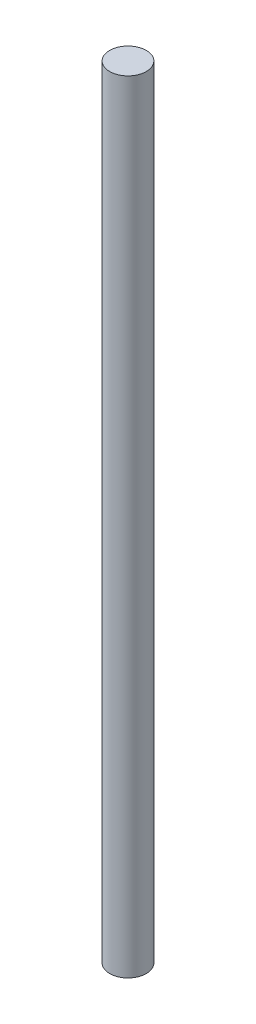
ISO-10303-21;
HEADER;
FILE_DESCRIPTION(('STEP AP214'),'2;1');
FILE_NAME('part.step','',(''),(''),'','','');
FILE_SCHEMA(('AUTOMOTIVE_DESIGN { 1 0 10303 214 1 1 1 1 }'));
ENDSEC;
DATA;
#1=APPLICATION_CONTEXT('core data for automotive mechanical design processes');
#2=APPLICATION_PROTOCOL_DEFINITION('international standard','automotive_design',2000,#1);
#3=PRODUCT_CONTEXT('',#1,'mechanical');
#4=PRODUCT('Part','Part','',(#3));
#5=PRODUCT_RELATED_PRODUCT_CATEGORY('part','',(#4));
#6=PRODUCT_DEFINITION_FORMATION('','',#4);
#7=PRODUCT_DEFINITION_CONTEXT('part definition',#1,'design');
#8=PRODUCT_DEFINITION('design','',#6,#7);
#9=PRODUCT_DEFINITION_SHAPE('','',#8);
#10=(LENGTH_UNIT() NAMED_UNIT(*) SI_UNIT(.MILLI.,.METRE.));
#11=(NAMED_UNIT(*) PLANE_ANGLE_UNIT() SI_UNIT($,.RADIAN.));
#12=(NAMED_UNIT(*) SI_UNIT($,.STERADIAN.) SOLID_ANGLE_UNIT());
#13=UNCERTAINTY_MEASURE_WITH_UNIT(LENGTH_MEASURE(1.E-05),#10,'distance_accuracy_value','');
#14=(GEOMETRIC_REPRESENTATION_CONTEXT(3) GLOBAL_UNCERTAINTY_ASSIGNED_CONTEXT((#13)) GLOBAL_UNIT_ASSIGNED_CONTEXT((#10,
#11,#12)) REPRESENTATION_CONTEXT('',''));
#15=CARTESIAN_POINT('',(0.,0.,0.));
#16=DIRECTION('',(0.,0.,1.));
#17=DIRECTION('',(1.,0.,0.));
#18=AXIS2_PLACEMENT_3D('',#15,#16,#17);
#19=CARTESIAN_POINT('',(0.,64.,0.));
#20=DIRECTION('',(0.,-1.,0.));
#21=DIRECTION('',(0.,0.,-1.));
#22=AXIS2_PLACEMENT_3D('',#19,#20,#21);
#23=CYLINDRICAL_SURFACE('',#22,1.5);
#24=CARTESIAN_POINT('',(0.,64.,0.));
#25=DIRECTION('',(0.,1.,0.));
#26=DIRECTION('',(0.,0.,1.));
#27=AXIS2_PLACEMENT_3D('',#24,#25,#26);
#28=CIRCLE('',#27,1.5);
#29=CARTESIAN_POINT('',(0.,64.,1.5));
#30=VERTEX_POINT('',#29);
#31=EDGE_CURVE('E10',#30,#30,#28,.T.);
#32=ORIENTED_EDGE('',*,*,#31,.F.);
#33=EDGE_LOOP('',(#32));
#34=FACE_BOUND('',#33,.T.);
#35=CARTESIAN_POINT('',(0.,0.,0.));
#36=DIRECTION('',(0.,1.,0.));
#37=DIRECTION('',(0.,0.,1.));
#38=AXIS2_PLACEMENT_3D('',#35,#36,#37);
#39=CIRCLE('',#38,1.5);
#40=CARTESIAN_POINT('',(0.,0.,1.5));
#41=VERTEX_POINT('',#40);
#42=EDGE_CURVE('E36',#41,#41,#39,.T.);
#43=ORIENTED_EDGE('',*,*,#42,.T.);
#44=EDGE_LOOP('',(#43));
#45=FACE_BOUND('',#44,.T.);
#46=ADVANCED_FACE('F33',(#34,#45),#23,.T.);
#47=CARTESIAN_POINT('',(0.,64.,0.));
#48=DIRECTION('',(0.,1.,0.));
#49=DIRECTION('',(0.,0.,1.));
#50=AXIS2_PLACEMENT_3D('',#47,#48,#49);
#51=PLANE('',#50);
#52=ORIENTED_EDGE('',*,*,#31,.T.);
#53=EDGE_LOOP('',(#52));
#54=FACE_BOUND('',#53,.T.);
#55=ADVANCED_FACE('F48',(#54),#51,.T.);
#56=CARTESIAN_POINT('',(0.,0.,0.));
#57=DIRECTION('',(0.,1.,0.));
#58=DIRECTION('',(0.,0.,1.));
#59=AXIS2_PLACEMENT_3D('',#56,#57,#58);
#60=PLANE('',#59);
#61=ORIENTED_EDGE('',*,*,#42,.F.);
#62=EDGE_LOOP('',(#61));
#63=FACE_BOUND('',#62,.T.);
#64=ADVANCED_FACE('F46',(#63),#60,.F.);
#65=CLOSED_SHELL('',(#46,#55,#64));
#66=MANIFOLD_SOLID_BREP('B2',#65);
#67=ADVANCED_BREP_SHAPE_REPRESENTATION('',(#18,#66),#14);
#68=SHAPE_DEFINITION_REPRESENTATION(#9,#67);
ENDSEC;
END-ISO-10303-21;
